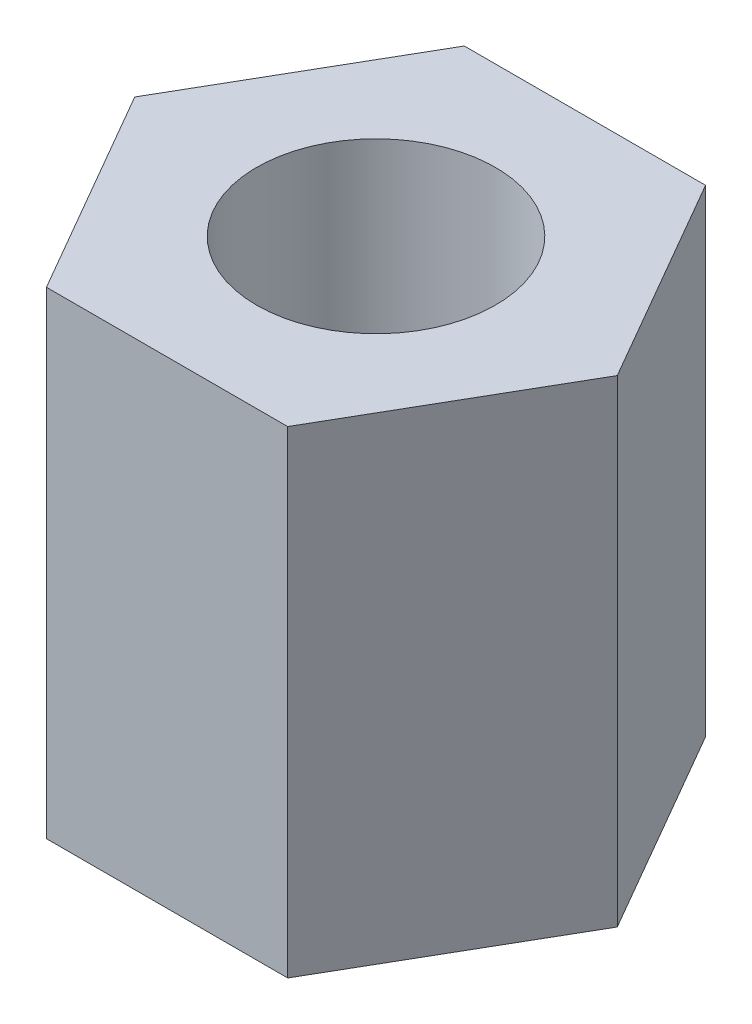
ISO-10303-21;
HEADER;
FILE_DESCRIPTION(('STEP AP214'),'2;1');
FILE_NAME('part.step','',(''),(''),'','','');
FILE_SCHEMA(('AUTOMOTIVE_DESIGN { 1 0 10303 214 1 1 1 1 }'));
ENDSEC;
DATA;
#1=APPLICATION_CONTEXT('core data for automotive mechanical design processes');
#2=APPLICATION_PROTOCOL_DEFINITION('international standard','automotive_design',2000,#1);
#3=PRODUCT_CONTEXT('',#1,'mechanical');
#4=PRODUCT('Part','Part','',(#3));
#5=PRODUCT_RELATED_PRODUCT_CATEGORY('part','',(#4));
#6=PRODUCT_DEFINITION_FORMATION('','',#4);
#7=PRODUCT_DEFINITION_CONTEXT('part definition',#1,'design');
#8=PRODUCT_DEFINITION('design','',#6,#7);
#9=PRODUCT_DEFINITION_SHAPE('','',#8);
#10=(LENGTH_UNIT() NAMED_UNIT(*) SI_UNIT(.MILLI.,.METRE.));
#11=(NAMED_UNIT(*) PLANE_ANGLE_UNIT() SI_UNIT($,.RADIAN.));
#12=(NAMED_UNIT(*) SI_UNIT($,.STERADIAN.) SOLID_ANGLE_UNIT());
#13=UNCERTAINTY_MEASURE_WITH_UNIT(LENGTH_MEASURE(1.E-05),#10,'distance_accuracy_value','');
#14=(GEOMETRIC_REPRESENTATION_CONTEXT(3) GLOBAL_UNCERTAINTY_ASSIGNED_CONTEXT((#13)) GLOBAL_UNIT_ASSIGNED_CONTEXT((#10,
#11,#12)) REPRESENTATION_CONTEXT('',''));
#15=CARTESIAN_POINT('',(0.,0.,0.));
#16=DIRECTION('',(0.,0.,1.));
#17=DIRECTION('',(1.,0.,0.));
#18=AXIS2_PLACEMENT_3D('',#15,#16,#17);
#19=CARTESIAN_POINT('',(4.04145188432738,8.,0.));
#20=DIRECTION('',(0.,1.,0.));
#21=DIRECTION('',(0.,0.,1.));
#22=AXIS2_PLACEMENT_3D('',#19,#20,#21);
#23=PLANE('',#22);
#24=DIRECTION('',(0.5,0.,-0.866025403784439));
#25=VECTOR('',#24,1.);
#26=CARTESIAN_POINT('',(2.02072594216369,8.,3.5));
#27=LINE('',#26,#25);
#28=CARTESIAN_POINT('',(2.02072594216369,8.,3.5));
#29=VERTEX_POINT('',#28);
#30=CARTESIAN_POINT('',(4.04145188432738,8.,0.));
#31=VERTEX_POINT('',#30);
#32=EDGE_CURVE('E128',#29,#31,#27,.T.);
#33=ORIENTED_EDGE('',*,*,#32,.T.);
#34=DIRECTION('',(-0.5,0.,-0.866025403784439));
#35=VECTOR('',#34,1.);
#36=CARTESIAN_POINT('',(4.04145188432738,8.,0.));
#37=LINE('',#36,#35);
#38=CARTESIAN_POINT('',(2.02072594216369,8.,-3.5));
#39=VERTEX_POINT('',#38);
#40=EDGE_CURVE('E86',#31,#39,#37,.T.);
#41=ORIENTED_EDGE('',*,*,#40,.T.);
#42=DIRECTION('',(-1.,0.,0.));
#43=VECTOR('',#42,1.);
#44=CARTESIAN_POINT('',(2.02072594216369,8.,-3.5));
#45=LINE('',#44,#43);
#46=CARTESIAN_POINT('',(-2.02072594216369,8.,-3.5));
#47=VERTEX_POINT('',#46);
#48=EDGE_CURVE('E99',#39,#47,#45,.T.);
#49=ORIENTED_EDGE('',*,*,#48,.T.);
#50=DIRECTION('',(-0.5,0.,0.866025403784439));
#51=VECTOR('',#50,1.);
#52=CARTESIAN_POINT('',(-2.02072594216369,8.,-3.5));
#53=LINE('',#52,#51);
#54=CARTESIAN_POINT('',(-4.04145188432738,8.,0.));
#55=VERTEX_POINT('',#54);
#56=EDGE_CURVE('E93',#47,#55,#53,.T.);
#57=ORIENTED_EDGE('',*,*,#56,.T.);
#58=DIRECTION('',(0.5,0.,0.866025403784439));
#59=VECTOR('',#58,1.);
#60=CARTESIAN_POINT('',(-4.04145188432738,8.,0.));
#61=LINE('',#60,#59);
#62=CARTESIAN_POINT('',(-2.02072594216369,8.,3.5));
#63=VERTEX_POINT('',#62);
#64=EDGE_CURVE('E97',#55,#63,#61,.T.);
#65=ORIENTED_EDGE('',*,*,#64,.T.);
#66=DIRECTION('',(1.,0.,0.));
#67=VECTOR('',#66,1.);
#68=CARTESIAN_POINT('',(-2.02072594216369,8.,3.5));
#69=LINE('',#68,#67);
#70=EDGE_CURVE('E49',#63,#29,#69,.T.);
#71=ORIENTED_EDGE('',*,*,#70,.T.);
#72=EDGE_LOOP('',(#33,#41,#49,#57,#65,#71));
#73=FACE_BOUND('',#72,.T.);
#74=CARTESIAN_POINT('',(0.,8.,0.));
#75=DIRECTION('',(0.,1.,0.));
#76=DIRECTION('',(0.,0.,1.));
#77=AXIS2_PLACEMENT_3D('',#74,#75,#76);
#78=CIRCLE('',#77,2.);
#79=CARTESIAN_POINT('',(0.,8.,2.));
#80=VERTEX_POINT('',#79);
#81=EDGE_CURVE('E121',#80,#80,#78,.T.);
#82=ORIENTED_EDGE('',*,*,#81,.F.);
#83=EDGE_LOOP('',(#82));
#84=FACE_BOUND('',#83,.T.);
#85=ADVANCED_FACE('F32',(#73,#84),#23,.T.);
#86=CARTESIAN_POINT('',(4.04145188432738,0.,0.));
#87=DIRECTION('',(0.,1.,0.));
#88=DIRECTION('',(0.,0.,1.));
#89=AXIS2_PLACEMENT_3D('',#86,#87,#88);
#90=PLANE('',#89);
#91=DIRECTION('',(0.5,0.,-0.866025403784439));
#92=VECTOR('',#91,1.);
#93=CARTESIAN_POINT('',(2.02072594216369,0.,3.5));
#94=LINE('',#93,#92);
#95=CARTESIAN_POINT('',(2.02072594216369,0.,3.5));
#96=VERTEX_POINT('',#95);
#97=CARTESIAN_POINT('',(4.04145188432738,0.,0.));
#98=VERTEX_POINT('',#97);
#99=EDGE_CURVE('E117',#96,#98,#94,.T.);
#100=ORIENTED_EDGE('',*,*,#99,.F.);
#101=DIRECTION('',(1.,0.,0.));
#102=VECTOR('',#101,1.);
#103=CARTESIAN_POINT('',(-2.02072594216369,0.,3.5));
#104=LINE('',#103,#102);
#105=CARTESIAN_POINT('',(-2.02072594216369,0.,3.5));
#106=VERTEX_POINT('',#105);
#107=EDGE_CURVE('E78',#106,#96,#104,.T.);
#108=ORIENTED_EDGE('',*,*,#107,.F.);
#109=DIRECTION('',(0.5,0.,0.866025403784439));
#110=VECTOR('',#109,1.);
#111=CARTESIAN_POINT('',(-4.04145188432738,0.,0.));
#112=LINE('',#111,#110);
#113=CARTESIAN_POINT('',(-4.04145188432738,0.,0.));
#114=VERTEX_POINT('',#113);
#115=EDGE_CURVE('E72',#114,#106,#112,.T.);
#116=ORIENTED_EDGE('',*,*,#115,.F.);
#117=DIRECTION('',(-0.5,0.,0.866025403784439));
#118=VECTOR('',#117,1.);
#119=CARTESIAN_POINT('',(-2.02072594216369,0.,-3.5));
#120=LINE('',#119,#118);
#121=CARTESIAN_POINT('',(-2.02072594216369,0.,-3.5));
#122=VERTEX_POINT('',#121);
#123=EDGE_CURVE('E107',#122,#114,#120,.T.);
#124=ORIENTED_EDGE('',*,*,#123,.F.);
#125=DIRECTION('',(-1.,0.,0.));
#126=VECTOR('',#125,1.);
#127=CARTESIAN_POINT('',(2.02072594216369,0.,-3.5));
#128=LINE('',#127,#126);
#129=CARTESIAN_POINT('',(2.02072594216369,0.,-3.5));
#130=VERTEX_POINT('',#129);
#131=EDGE_CURVE('E123',#130,#122,#128,.T.);
#132=ORIENTED_EDGE('',*,*,#131,.F.);
#133=DIRECTION('',(-0.5,0.,-0.866025403784439));
#134=VECTOR('',#133,1.);
#135=CARTESIAN_POINT('',(4.04145188432738,0.,0.));
#136=LINE('',#135,#134);
#137=EDGE_CURVE('E120',#98,#130,#136,.T.);
#138=ORIENTED_EDGE('',*,*,#137,.F.);
#139=EDGE_LOOP('',(#100,#108,#116,#124,#132,#138));
#140=FACE_BOUND('',#139,.T.);
#141=CARTESIAN_POINT('',(0.,0.,0.));
#142=DIRECTION('',(0.,1.,0.));
#143=DIRECTION('',(0.,0.,1.));
#144=AXIS2_PLACEMENT_3D('',#141,#142,#143);
#145=CIRCLE('',#144,2.);
#146=CARTESIAN_POINT('',(0.,0.,2.));
#147=VERTEX_POINT('',#146);
#148=EDGE_CURVE('E221',#147,#147,#145,.T.);
#149=ORIENTED_EDGE('',*,*,#148,.T.);
#150=EDGE_LOOP('',(#149));
#151=FACE_BOUND('',#150,.T.);
#152=ADVANCED_FACE('F137',(#140,#151),#90,.F.);
#153=CARTESIAN_POINT('',(2.02072594216369,8.,3.5));
#154=DIRECTION('',(-0.866025403784439,0.,-0.5));
#155=DIRECTION('',(-0.5,0.,0.866025403784439));
#156=AXIS2_PLACEMENT_3D('',#153,#154,#155);
#157=PLANE('',#156);
#158=ORIENTED_EDGE('',*,*,#99,.T.);
#159=DIRECTION('',(0.,-1.,0.));
#160=VECTOR('',#159,1.);
#161=CARTESIAN_POINT('',(4.04145188432738,8.,0.));
#162=LINE('',#161,#160);
#163=EDGE_CURVE('E11',#31,#98,#162,.T.);
#164=ORIENTED_EDGE('',*,*,#163,.F.);
#165=ORIENTED_EDGE('',*,*,#32,.F.);
#166=DIRECTION('',(0.,-1.,0.));
#167=VECTOR('',#166,1.);
#168=CARTESIAN_POINT('',(2.02072594216369,8.,3.5));
#169=LINE('',#168,#167);
#170=EDGE_CURVE('E113',#29,#96,#169,.T.);
#171=ORIENTED_EDGE('',*,*,#170,.T.);
#172=EDGE_LOOP('',(#158,#164,#165,#171));
#173=FACE_BOUND('',#172,.T.);
#174=ADVANCED_FACE('F34',(#173),#157,.F.);
#175=CARTESIAN_POINT('',(4.04145188432738,8.,0.));
#176=DIRECTION('',(-0.866025403784439,0.,0.5));
#177=DIRECTION('',(0.5,0.,0.866025403784439));
#178=AXIS2_PLACEMENT_3D('',#175,#176,#177);
#179=PLANE('',#178);
#180=ORIENTED_EDGE('',*,*,#137,.T.);
#181=DIRECTION('',(0.,-1.,0.));
#182=VECTOR('',#181,1.);
#183=CARTESIAN_POINT('',(2.02072594216369,8.,-3.5));
#184=LINE('',#183,#182);
#185=EDGE_CURVE('E41',#39,#130,#184,.T.);
#186=ORIENTED_EDGE('',*,*,#185,.F.);
#187=ORIENTED_EDGE('',*,*,#40,.F.);
#188=ORIENTED_EDGE('',*,*,#163,.T.);
#189=EDGE_LOOP('',(#180,#186,#187,#188));
#190=FACE_BOUND('',#189,.T.);
#191=ADVANCED_FACE('F162',(#190),#179,.F.);
#192=CARTESIAN_POINT('',(2.02072594216369,8.,-3.5));
#193=DIRECTION('',(0.,0.,1.));
#194=DIRECTION('',(1.,0.,0.));
#195=AXIS2_PLACEMENT_3D('',#192,#193,#194);
#196=PLANE('',#195);
#197=ORIENTED_EDGE('',*,*,#131,.T.);
#198=DIRECTION('',(0.,-1.,0.));
#199=VECTOR('',#198,1.);
#200=CARTESIAN_POINT('',(-2.02072594216369,8.,-3.5));
#201=LINE('',#200,#199);
#202=EDGE_CURVE('E108',#47,#122,#201,.T.);
#203=ORIENTED_EDGE('',*,*,#202,.F.);
#204=ORIENTED_EDGE('',*,*,#48,.F.);
#205=ORIENTED_EDGE('',*,*,#185,.T.);
#206=EDGE_LOOP('',(#197,#203,#204,#205));
#207=FACE_BOUND('',#206,.T.);
#208=ADVANCED_FACE('F134',(#207),#196,.F.);
#209=CARTESIAN_POINT('',(-2.02072594216369,8.,-3.5));
#210=DIRECTION('',(0.866025403784439,0.,0.5));
#211=DIRECTION('',(0.5,0.,-0.866025403784439));
#212=AXIS2_PLACEMENT_3D('',#209,#210,#211);
#213=PLANE('',#212);
#214=ORIENTED_EDGE('',*,*,#123,.T.);
#215=DIRECTION('',(0.,-1.,0.));
#216=VECTOR('',#215,1.);
#217=CARTESIAN_POINT('',(-4.04145188432738,8.,0.));
#218=LINE('',#217,#216);
#219=EDGE_CURVE('E104',#55,#114,#218,.T.);
#220=ORIENTED_EDGE('',*,*,#219,.F.);
#221=ORIENTED_EDGE('',*,*,#56,.F.);
#222=ORIENTED_EDGE('',*,*,#202,.T.);
#223=EDGE_LOOP('',(#214,#220,#221,#222));
#224=FACE_BOUND('',#223,.T.);
#225=ADVANCED_FACE('F105',(#224),#213,.F.);
#226=CARTESIAN_POINT('',(-4.04145188432738,8.,0.));
#227=DIRECTION('',(0.866025403784439,0.,-0.5));
#228=DIRECTION('',(-0.5,0.,-0.866025403784439));
#229=AXIS2_PLACEMENT_3D('',#226,#227,#228);
#230=PLANE('',#229);
#231=ORIENTED_EDGE('',*,*,#115,.T.);
#232=DIRECTION('',(0.,-1.,0.));
#233=VECTOR('',#232,1.);
#234=CARTESIAN_POINT('',(-2.02072594216369,8.,3.5));
#235=LINE('',#234,#233);
#236=EDGE_CURVE('E109',#63,#106,#235,.T.);
#237=ORIENTED_EDGE('',*,*,#236,.F.);
#238=ORIENTED_EDGE('',*,*,#64,.F.);
#239=ORIENTED_EDGE('',*,*,#219,.T.);
#240=EDGE_LOOP('',(#231,#237,#238,#239));
#241=FACE_BOUND('',#240,.T.);
#242=ADVANCED_FACE('F111',(#241),#230,.F.);
#243=CARTESIAN_POINT('',(-2.02072594216369,8.,3.5));
#244=DIRECTION('',(0.,0.,-1.));
#245=DIRECTION('',(-1.,0.,0.));
#246=AXIS2_PLACEMENT_3D('',#243,#244,#245);
#247=PLANE('',#246);
#248=ORIENTED_EDGE('',*,*,#107,.T.);
#249=ORIENTED_EDGE('',*,*,#170,.F.);
#250=ORIENTED_EDGE('',*,*,#70,.F.);
#251=ORIENTED_EDGE('',*,*,#236,.T.);
#252=EDGE_LOOP('',(#248,#249,#250,#251));
#253=FACE_BOUND('',#252,.T.);
#254=ADVANCED_FACE('F142',(#253),#247,.F.);
#255=CARTESIAN_POINT('',(0.,8.,0.));
#256=DIRECTION('',(0.,-1.,0.));
#257=DIRECTION('',(0.,0.,-1.));
#258=AXIS2_PLACEMENT_3D('',#255,#256,#257);
#259=CYLINDRICAL_SURFACE('',#258,2.);
#260=ORIENTED_EDGE('',*,*,#81,.T.);
#261=EDGE_LOOP('',(#260));
#262=FACE_BOUND('',#261,.T.);
#263=ORIENTED_EDGE('',*,*,#148,.F.);
#264=EDGE_LOOP('',(#263));
#265=FACE_BOUND('',#264,.T.);
#266=ADVANCED_FACE('F144',(#262,#265),#259,.F.);
#267=CLOSED_SHELL('',(#85,#152,#174,#191,#208,#225,#242,#254,#266));
#268=MANIFOLD_SOLID_BREP('B2',#267);
#269=ADVANCED_BREP_SHAPE_REPRESENTATION('',(#18,#268),#14);
#270=SHAPE_DEFINITION_REPRESENTATION(#9,#269);
ENDSEC;
END-ISO-10303-21;
